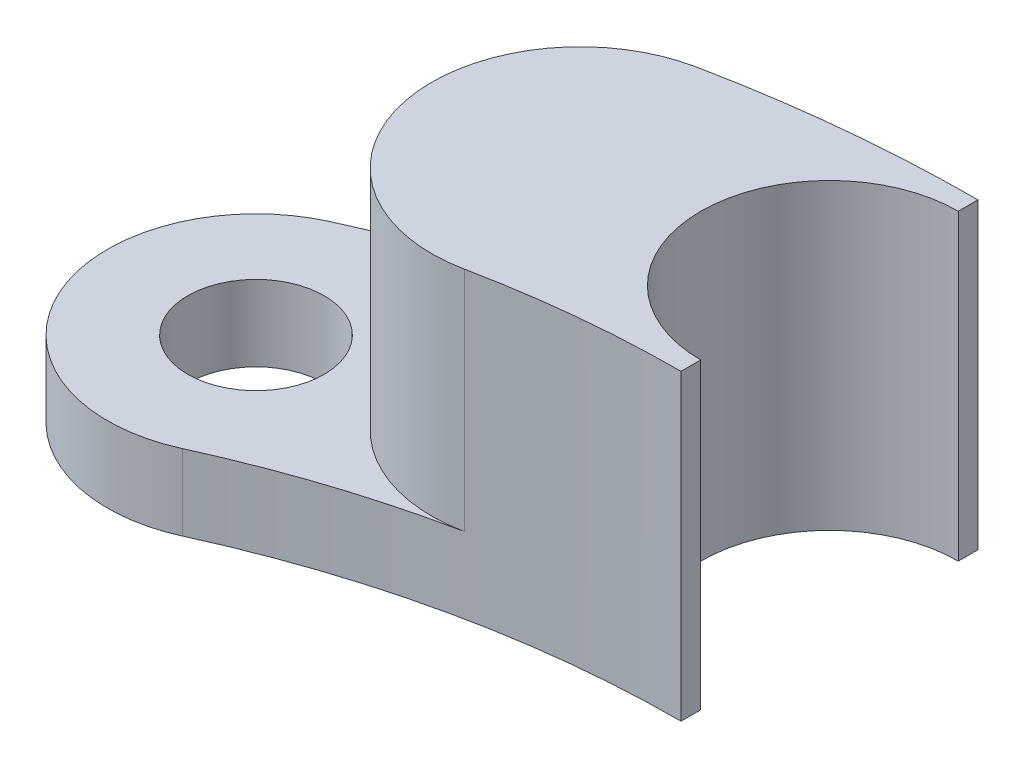
ISO-10303-21;
HEADER;
FILE_DESCRIPTION(('STEP AP214'),'2;1');
FILE_NAME('part.step','',(''),(''),'','','');
FILE_SCHEMA(('AUTOMOTIVE_DESIGN { 1 0 10303 214 1 1 1 1 }'));
ENDSEC;
DATA;
#1=APPLICATION_CONTEXT('core data for automotive mechanical design processes');
#2=APPLICATION_PROTOCOL_DEFINITION('international standard','automotive_design',2000,#1);
#3=PRODUCT_CONTEXT('',#1,'mechanical');
#4=PRODUCT('Part','Part','',(#3));
#5=PRODUCT_RELATED_PRODUCT_CATEGORY('part','',(#4));
#6=PRODUCT_DEFINITION_FORMATION('','',#4);
#7=PRODUCT_DEFINITION_CONTEXT('part definition',#1,'design');
#8=PRODUCT_DEFINITION('design','',#6,#7);
#9=PRODUCT_DEFINITION_SHAPE('','',#8);
#10=(LENGTH_UNIT() NAMED_UNIT(*) SI_UNIT(.MILLI.,.METRE.));
#11=(NAMED_UNIT(*) PLANE_ANGLE_UNIT() SI_UNIT($,.RADIAN.));
#12=(NAMED_UNIT(*) SI_UNIT($,.STERADIAN.) SOLID_ANGLE_UNIT());
#13=UNCERTAINTY_MEASURE_WITH_UNIT(LENGTH_MEASURE(1.E-05),#10,'distance_accuracy_value','');
#14=(GEOMETRIC_REPRESENTATION_CONTEXT(3) GLOBAL_UNCERTAINTY_ASSIGNED_CONTEXT((#13)) GLOBAL_UNIT_ASSIGNED_CONTEXT((#10,
#11,#12)) REPRESENTATION_CONTEXT('',''));
#15=CARTESIAN_POINT('',(0.,0.,0.));
#16=DIRECTION('',(0.,0.,1.));
#17=DIRECTION('',(1.,0.,0.));
#18=AXIS2_PLACEMENT_3D('',#15,#16,#17);
#19=CARTESIAN_POINT('',(-15.550996599609,10.,-34.1235476578704));
#20=DIRECTION('',(0.,-1.,0.));
#21=DIRECTION('',(0.,0.,-1.));
#22=AXIS2_PLACEMENT_3D('',#19,#20,#21);
#23=CYLINDRICAL_SURFACE('',#22,4.9);
#24=DIRECTION('',(0.,-1.,0.));
#25=VECTOR('',#24,1.);
#26=CARTESIAN_POINT('',(-13.5189997105934,10.,-29.6647374305753));
#27=LINE('',#26,#25);
#28=CARTESIAN_POINT('',(-13.5189997105934,2.5,-29.6647374305753));
#29=VERTEX_POINT('',#28);
#30=CARTESIAN_POINT('',(-13.5189997105934,0.,-29.6647374305753));
#31=VERTEX_POINT('',#30);
#32=EDGE_CURVE('E45',#29,#31,#27,.T.);
#33=ORIENTED_EDGE('',*,*,#32,.F.);
#34=CARTESIAN_POINT('',(-15.550996599609,2.5,-34.1235476578704));
#35=DIRECTION('',(0.,1.,0.));
#36=DIRECTION('',(0.,0.,1.));
#37=AXIS2_PLACEMENT_3D('',#34,#35,#36);
#38=CIRCLE('',#37,4.9);
#39=CARTESIAN_POINT('',(-17.5829934886246,2.5,-38.5823578851654));
#40=VERTEX_POINT('',#39);
#41=EDGE_CURVE('E123',#40,#29,#38,.T.);
#42=ORIENTED_EDGE('',*,*,#41,.F.);
#43=DIRECTION('',(0.,-1.,0.));
#44=VECTOR('',#43,1.);
#45=CARTESIAN_POINT('',(-17.5829934886246,10.,-38.5823578851654));
#46=LINE('',#45,#44);
#47=CARTESIAN_POINT('',(-17.5829934886246,0.,-38.5823578851654));
#48=VERTEX_POINT('',#47);
#49=EDGE_CURVE('E11',#40,#48,#46,.T.);
#50=ORIENTED_EDGE('',*,*,#49,.T.);
#51=CARTESIAN_POINT('',(-15.550996599609,0.,-34.1235476578704));
#52=DIRECTION('',(0.,1.,0.));
#53=DIRECTION('',(0.,0.,1.));
#54=AXIS2_PLACEMENT_3D('',#51,#52,#53);
#55=CIRCLE('',#54,4.9);
#56=EDGE_CURVE('E147',#31,#48,#55,.F.);
#57=ORIENTED_EDGE('',*,*,#56,.F.);
#58=EDGE_LOOP('',(#33,#42,#50,#57));
#59=FACE_BOUND('',#58,.T.);
#60=ADVANCED_FACE('F37',(#59),#23,.T.);
#61=CARTESIAN_POINT('',(-15.550996599609,10.,-34.1235476578704));
#62=DIRECTION('',(0.,-1.,0.));
#63=DIRECTION('',(0.,0.,-1.));
#64=AXIS2_PLACEMENT_3D('',#61,#62,#63);
#65=CYLINDRICAL_SURFACE('',#64,2.25);
#66=CARTESIAN_POINT('',(-15.550996599609,0.,-34.1235476578704));
#67=DIRECTION('',(0.,1.,0.));
#68=DIRECTION('',(0.,0.,1.));
#69=AXIS2_PLACEMENT_3D('',#66,#67,#68);
#70=CIRCLE('',#69,2.25);
#71=CARTESIAN_POINT('',(-15.550996599609,0.,-31.8735476578704));
#72=VERTEX_POINT('',#71);
#73=EDGE_CURVE('E138',#72,#72,#70,.F.);
#74=ORIENTED_EDGE('',*,*,#73,.T.);
#75=EDGE_LOOP('',(#74));
#76=FACE_BOUND('',#75,.T.);
#77=CARTESIAN_POINT('',(-15.550996599609,2.5,-34.1235476578704));
#78=DIRECTION('',(0.,1.,0.));
#79=DIRECTION('',(0.,0.,1.));
#80=AXIS2_PLACEMENT_3D('',#77,#78,#79);
#81=CIRCLE('',#80,2.25);
#82=CARTESIAN_POINT('',(-15.550996599609,2.5,-31.8735476578704));
#83=VERTEX_POINT('',#82);
#84=EDGE_CURVE('E125',#83,#83,#81,.F.);
#85=ORIENTED_EDGE('',*,*,#84,.F.);
#86=EDGE_LOOP('',(#85));
#87=FACE_BOUND('',#86,.T.);
#88=ADVANCED_FACE('F200',(#76,#87),#65,.F.);
#89=CARTESIAN_POINT('',(0.,10.,0.));
#90=DIRECTION('',(0.,1.,0.));
#91=DIRECTION('',(0.,0.,1.));
#92=AXIS2_PLACEMENT_3D('',#89,#90,#91);
#93=PLANE('',#92);
#94=CARTESIAN_POINT('',(-7.47629754064491,10.,-36.7471764232811));
#95=DIRECTION('',(0.,1.,0.));
#96=DIRECTION('',(0.,0.,1.));
#97=AXIS2_PLACEMENT_3D('',#94,#95,#96);
#98=CIRCLE('',#97,4.9);
#99=CARTESIAN_POINT('',(-6.49939466200064,10.,-31.945545370639));
#100=VERTEX_POINT('',#99);
#101=CARTESIAN_POINT('',(-8.45320041928918,10.,-41.5488074759232));
#102=VERTEX_POINT('',#101);
#103=EDGE_CURVE('E180',#100,#102,#98,.F.);
#104=ORIENTED_EDGE('',*,*,#103,.F.);
#105=CARTESIAN_POINT('',(0.,10.,0.));
#106=DIRECTION('',(0.,1.,0.));
#107=DIRECTION('',(0.,0.,1.));
#108=AXIS2_PLACEMENT_3D('',#105,#106,#107);
#109=CIRCLE('',#108,32.6);
#110=CARTESIAN_POINT('',(0.,10.,-32.6));
#111=VERTEX_POINT('',#110);
#112=EDGE_CURVE('E129',#111,#100,#109,.T.);
#113=ORIENTED_EDGE('',*,*,#112,.F.);
#114=DIRECTION('',(0.,0.,-1.));
#115=VECTOR('',#114,1.);
#116=CARTESIAN_POINT('',(0.,10.,0.));
#117=LINE('',#116,#115);
#118=CARTESIAN_POINT('',(0.,10.,-33.25));
#119=VERTEX_POINT('',#118);
#120=EDGE_CURVE('E140',#111,#119,#117,.T.);
#121=ORIENTED_EDGE('',*,*,#120,.T.);
#122=CARTESIAN_POINT('',(0.,10.,-37.5));
#123=DIRECTION('',(0.,1.,0.));
#124=DIRECTION('',(0.,0.,1.));
#125=AXIS2_PLACEMENT_3D('',#122,#123,#124);
#126=CIRCLE('',#125,4.25);
#127=CARTESIAN_POINT('',(0.,10.,-41.75));
#128=VERTEX_POINT('',#127);
#129=EDGE_CURVE('E142',#128,#119,#126,.T.);
#130=ORIENTED_EDGE('',*,*,#129,.F.);
#131=CARTESIAN_POINT('',(0.,10.,-42.4));
#132=VERTEX_POINT('',#131);
#133=EDGE_CURVE('E61',#128,#132,#117,.T.);
#134=ORIENTED_EDGE('',*,*,#133,.T.);
#135=CARTESIAN_POINT('',(0.,10.,0.));
#136=DIRECTION('',(0.,1.,0.));
#137=DIRECTION('',(0.,0.,1.));
#138=AXIS2_PLACEMENT_3D('',#135,#136,#137);
#139=CIRCLE('',#138,42.4);
#140=EDGE_CURVE('E136',#132,#102,#139,.T.);
#141=ORIENTED_EDGE('',*,*,#140,.T.);
#142=EDGE_LOOP('',(#104,#113,#121,#130,#134,#141));
#143=FACE_BOUND('',#142,.T.);
#144=ADVANCED_FACE('F179',(#143),#93,.T.);
#145=CARTESIAN_POINT('',(0.,10.,0.));
#146=DIRECTION('',(0.,-1.,0.));
#147=DIRECTION('',(0.,0.,-1.));
#148=AXIS2_PLACEMENT_3D('',#145,#146,#147);
#149=CYLINDRICAL_SURFACE('',#148,42.4);
#150=CARTESIAN_POINT('',(0.,2.5,0.));
#151=DIRECTION('',(0.,1.,0.));
#152=DIRECTION('',(0.,0.,1.));
#153=AXIS2_PLACEMENT_3D('',#150,#151,#152);
#154=CIRCLE('',#153,42.4);
#155=CARTESIAN_POINT('',(-8.45320041928918,2.5,-41.5488074759232));
#156=VERTEX_POINT('',#155);
#157=EDGE_CURVE('E117',#156,#40,#154,.T.);
#158=ORIENTED_EDGE('',*,*,#157,.F.);
#159=DIRECTION('',(0.,1.,0.));
#160=VECTOR('',#159,1.);
#161=CARTESIAN_POINT('',(-8.45320041928918,2.5,-41.5488074759232));
#162=LINE('',#161,#160);
#163=EDGE_CURVE('E114',#156,#102,#162,.T.);
#164=ORIENTED_EDGE('',*,*,#163,.T.);
#165=ORIENTED_EDGE('',*,*,#140,.F.);
#166=DIRECTION('',(0.,-1.,0.));
#167=VECTOR('',#166,1.);
#168=CARTESIAN_POINT('',(0.,10.,-42.4));
#169=LINE('',#168,#167);
#170=CARTESIAN_POINT('',(0.,0.,-42.4));
#171=VERTEX_POINT('',#170);
#172=EDGE_CURVE('E161',#132,#171,#169,.T.);
#173=ORIENTED_EDGE('',*,*,#172,.T.);
#174=CARTESIAN_POINT('',(0.,0.,0.));
#175=DIRECTION('',(0.,1.,0.));
#176=DIRECTION('',(0.,0.,1.));
#177=AXIS2_PLACEMENT_3D('',#174,#175,#176);
#178=CIRCLE('',#177,42.4);
#179=EDGE_CURVE('E131',#171,#48,#178,.T.);
#180=ORIENTED_EDGE('',*,*,#179,.T.);
#181=ORIENTED_EDGE('',*,*,#49,.F.);
#182=EDGE_LOOP('',(#158,#164,#165,#173,#180,#181));
#183=FACE_BOUND('',#182,.T.);
#184=ADVANCED_FACE('F39',(#183),#149,.T.);
#185=CARTESIAN_POINT('',(0.,10.,0.));
#186=DIRECTION('',(0.,-1.,0.));
#187=DIRECTION('',(0.,0.,-1.));
#188=AXIS2_PLACEMENT_3D('',#185,#186,#187);
#189=CYLINDRICAL_SURFACE('',#188,32.6);
#190=DIRECTION('',(0.,1.,0.));
#191=VECTOR('',#190,1.);
#192=CARTESIAN_POINT('',(-6.49939466200064,2.5,-31.945545370639));
#193=LINE('',#192,#191);
#194=CARTESIAN_POINT('',(-6.49939466200064,2.5,-31.945545370639));
#195=VERTEX_POINT('',#194);
#196=EDGE_CURVE('E52',#195,#100,#193,.T.);
#197=ORIENTED_EDGE('',*,*,#196,.F.);
#198=CARTESIAN_POINT('',(0.,2.5,0.));
#199=DIRECTION('',(0.,1.,0.));
#200=DIRECTION('',(0.,0.,1.));
#201=AXIS2_PLACEMENT_3D('',#198,#199,#200);
#202=CIRCLE('',#201,32.6);
#203=EDGE_CURVE('E118',#29,#195,#202,.F.);
#204=ORIENTED_EDGE('',*,*,#203,.F.);
#205=ORIENTED_EDGE('',*,*,#32,.T.);
#206=CARTESIAN_POINT('',(0.,0.,0.));
#207=DIRECTION('',(0.,1.,0.));
#208=DIRECTION('',(0.,0.,1.));
#209=AXIS2_PLACEMENT_3D('',#206,#207,#208);
#210=CIRCLE('',#209,32.6);
#211=CARTESIAN_POINT('',(0.,0.,-32.6));
#212=VERTEX_POINT('',#211);
#213=EDGE_CURVE('E150',#212,#31,#210,.T.);
#214=ORIENTED_EDGE('',*,*,#213,.F.);
#215=DIRECTION('',(0.,-1.,0.));
#216=VECTOR('',#215,1.);
#217=CARTESIAN_POINT('',(0.,10.,-32.6));
#218=LINE('',#217,#216);
#219=EDGE_CURVE('E94',#111,#212,#218,.T.);
#220=ORIENTED_EDGE('',*,*,#219,.F.);
#221=ORIENTED_EDGE('',*,*,#112,.T.);
#222=EDGE_LOOP('',(#197,#204,#205,#214,#220,#221));
#223=FACE_BOUND('',#222,.T.);
#224=ADVANCED_FACE('F127',(#223),#189,.F.);
#225=CARTESIAN_POINT('',(0.,10.,0.));
#226=DIRECTION('',(-1.,0.,0.));
#227=DIRECTION('',(0.,0.,1.));
#228=AXIS2_PLACEMENT_3D('',#225,#226,#227);
#229=PLANE('',#228);
#230=DIRECTION('',(0.,0.,-1.));
#231=VECTOR('',#230,1.);
#232=CARTESIAN_POINT('',(0.,0.,0.));
#233=LINE('',#232,#231);
#234=CARTESIAN_POINT('',(0.,0.,-33.25));
#235=VERTEX_POINT('',#234);
#236=EDGE_CURVE('E153',#212,#235,#233,.T.);
#237=ORIENTED_EDGE('',*,*,#236,.T.);
#238=DIRECTION('',(0.,-1.,0.));
#239=VECTOR('',#238,1.);
#240=CARTESIAN_POINT('',(0.,10.,-33.25));
#241=LINE('',#240,#239);
#242=EDGE_CURVE('E165',#119,#235,#241,.T.);
#243=ORIENTED_EDGE('',*,*,#242,.F.);
#244=ORIENTED_EDGE('',*,*,#120,.F.);
#245=ORIENTED_EDGE('',*,*,#219,.T.);
#246=EDGE_LOOP('',(#237,#243,#244,#245));
#247=FACE_BOUND('',#246,.T.);
#248=ADVANCED_FACE('F178',(#247),#229,.F.);
#249=CARTESIAN_POINT('',(0.,10.,-37.5));
#250=DIRECTION('',(0.,-1.,0.));
#251=DIRECTION('',(0.,0.,-1.));
#252=AXIS2_PLACEMENT_3D('',#249,#250,#251);
#253=CYLINDRICAL_SURFACE('',#252,4.25);
#254=CARTESIAN_POINT('',(0.,0.,-37.5));
#255=DIRECTION('',(0.,1.,0.));
#256=DIRECTION('',(0.,0.,1.));
#257=AXIS2_PLACEMENT_3D('',#254,#255,#256);
#258=CIRCLE('',#257,4.25);
#259=CARTESIAN_POINT('',(0.,0.,-41.75));
#260=VERTEX_POINT('',#259);
#261=EDGE_CURVE('E156',#260,#235,#258,.T.);
#262=ORIENTED_EDGE('',*,*,#261,.F.);
#263=DIRECTION('',(0.,-1.,0.));
#264=VECTOR('',#263,1.);
#265=CARTESIAN_POINT('',(0.,10.,-41.75));
#266=LINE('',#265,#264);
#267=EDGE_CURVE('E163',#128,#260,#266,.T.);
#268=ORIENTED_EDGE('',*,*,#267,.F.);
#269=ORIENTED_EDGE('',*,*,#129,.T.);
#270=ORIENTED_EDGE('',*,*,#242,.T.);
#271=EDGE_LOOP('',(#262,#268,#269,#270));
#272=FACE_BOUND('',#271,.T.);
#273=ADVANCED_FACE('F187',(#272),#253,.F.);
#274=EDGE_CURVE('E87',#260,#171,#233,.T.);
#275=ORIENTED_EDGE('',*,*,#274,.T.);
#276=ORIENTED_EDGE('',*,*,#172,.F.);
#277=ORIENTED_EDGE('',*,*,#133,.F.);
#278=ORIENTED_EDGE('',*,*,#267,.T.);
#279=EDGE_LOOP('',(#275,#276,#277,#278));
#280=FACE_BOUND('',#279,.T.);
#281=ADVANCED_FACE('F188',(#280),#229,.F.);
#282=CARTESIAN_POINT('',(0.,0.,0.));
#283=DIRECTION('',(0.,1.,0.));
#284=DIRECTION('',(0.,0.,1.));
#285=AXIS2_PLACEMENT_3D('',#282,#283,#284);
#286=PLANE('',#285);
#287=ORIENTED_EDGE('',*,*,#179,.F.);
#288=ORIENTED_EDGE('',*,*,#274,.F.);
#289=ORIENTED_EDGE('',*,*,#261,.T.);
#290=ORIENTED_EDGE('',*,*,#236,.F.);
#291=ORIENTED_EDGE('',*,*,#213,.T.);
#292=ORIENTED_EDGE('',*,*,#56,.T.);
#293=EDGE_LOOP('',(#287,#288,#289,#290,#291,#292));
#294=FACE_BOUND('',#293,.T.);
#295=ORIENTED_EDGE('',*,*,#73,.F.);
#296=EDGE_LOOP('',(#295));
#297=FACE_BOUND('',#296,.T.);
#298=ADVANCED_FACE('F173',(#294,#297),#286,.F.);
#299=CARTESIAN_POINT('',(-7.47629754064491,2.5,-36.7471764232811));
#300=DIRECTION('',(0.,1.,0.));
#301=DIRECTION('',(0.,0.,1.));
#302=AXIS2_PLACEMENT_3D('',#299,#300,#301);
#303=CYLINDRICAL_SURFACE('',#302,4.9);
#304=ORIENTED_EDGE('',*,*,#103,.T.);
#305=ORIENTED_EDGE('',*,*,#163,.F.);
#306=CARTESIAN_POINT('',(-7.47629754064491,2.5,-36.7471764232811));
#307=DIRECTION('',(0.,1.,0.));
#308=DIRECTION('',(0.,0.,1.));
#309=AXIS2_PLACEMENT_3D('',#306,#307,#308);
#310=CIRCLE('',#309,4.9);
#311=EDGE_CURVE('E110',#195,#156,#310,.F.);
#312=ORIENTED_EDGE('',*,*,#311,.F.);
#313=ORIENTED_EDGE('',*,*,#196,.T.);
#314=EDGE_LOOP('',(#304,#305,#312,#313));
#315=FACE_BOUND('',#314,.T.);
#316=ADVANCED_FACE('F112',(#315),#303,.T.);
#317=CARTESIAN_POINT('',(0.,2.5,0.));
#318=DIRECTION('',(0.,1.,0.));
#319=DIRECTION('',(0.,0.,1.));
#320=AXIS2_PLACEMENT_3D('',#317,#318,#319);
#321=PLANE('',#320);
#322=ORIENTED_EDGE('',*,*,#84,.T.);
#323=EDGE_LOOP('',(#322));
#324=FACE_BOUND('',#323,.T.);
#325=ORIENTED_EDGE('',*,*,#203,.T.);
#326=ORIENTED_EDGE('',*,*,#311,.T.);
#327=ORIENTED_EDGE('',*,*,#157,.T.);
#328=ORIENTED_EDGE('',*,*,#41,.T.);
#329=EDGE_LOOP('',(#325,#326,#327,#328));
#330=FACE_BOUND('',#329,.T.);
#331=ADVANCED_FACE('F121',(#324,#330),#321,.T.);
#332=CLOSED_SHELL('',(#60,#88,#144,#184,#224,#248,#273,#281,#298,#316,#331));
#333=MANIFOLD_SOLID_BREP('B2',#332);
#334=ADVANCED_BREP_SHAPE_REPRESENTATION('',(#18,#333),#14);
#335=SHAPE_DEFINITION_REPRESENTATION(#9,#334);
ENDSEC;
END-ISO-10303-21;
